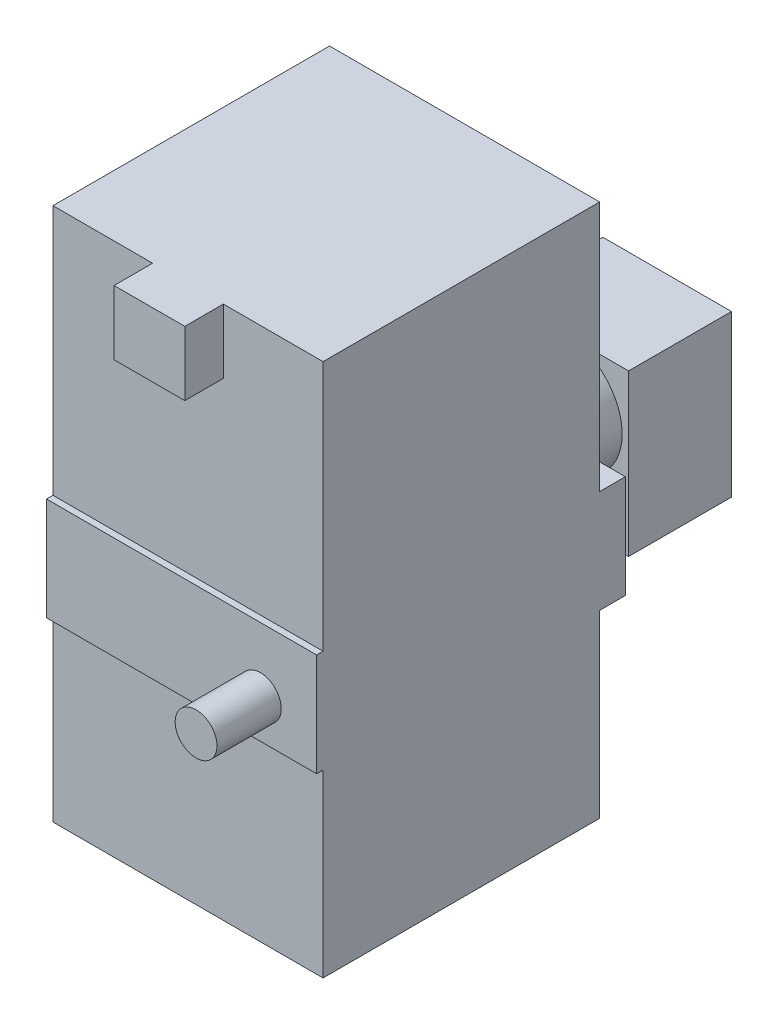
ISO-10303-21;
HEADER;
FILE_DESCRIPTION(('STEP AP214'),'2;1');
FILE_NAME('part.step','',(''),(''),'','','');
FILE_SCHEMA(('AUTOMOTIVE_DESIGN { 1 0 10303 214 1 1 1 1 }'));
ENDSEC;
DATA;
#1=APPLICATION_CONTEXT('core data for automotive mechanical design processes');
#2=APPLICATION_PROTOCOL_DEFINITION('international standard','automotive_design',2000,#1);
#3=PRODUCT_CONTEXT('',#1,'mechanical');
#4=PRODUCT('Part','Part','',(#3));
#5=PRODUCT_RELATED_PRODUCT_CATEGORY('part','',(#4));
#6=PRODUCT_DEFINITION_FORMATION('','',#4);
#7=PRODUCT_DEFINITION_CONTEXT('part definition',#1,'design');
#8=PRODUCT_DEFINITION('design','',#6,#7);
#9=PRODUCT_DEFINITION_SHAPE('','',#8);
#10=(LENGTH_UNIT() NAMED_UNIT(*) SI_UNIT(.MILLI.,.METRE.));
#11=(NAMED_UNIT(*) PLANE_ANGLE_UNIT() SI_UNIT($,.RADIAN.));
#12=(NAMED_UNIT(*) SI_UNIT($,.STERADIAN.) SOLID_ANGLE_UNIT());
#13=UNCERTAINTY_MEASURE_WITH_UNIT(LENGTH_MEASURE(1.E-05),#10,'distance_accuracy_value','');
#14=(GEOMETRIC_REPRESENTATION_CONTEXT(3) GLOBAL_UNCERTAINTY_ASSIGNED_CONTEXT((#13)) GLOBAL_UNIT_ASSIGNED_CONTEXT((#10,
#11,#12)) REPRESENTATION_CONTEXT('',''));
#15=CARTESIAN_POINT('',(0.,0.,0.));
#16=DIRECTION('',(0.,0.,1.));
#17=DIRECTION('',(1.,0.,0.));
#18=AXIS2_PLACEMENT_3D('',#15,#16,#17);
#19=CARTESIAN_POINT('',(0.,0.,-58.));
#20=DIRECTION('',(0.,0.,-1.));
#21=DIRECTION('',(-1.,0.,0.));
#22=AXIS2_PLACEMENT_3D('',#19,#20,#21);
#23=PLANE('',#22);
#24=DIRECTION('',(0.,-1.,0.));
#25=VECTOR('',#24,1.);
#26=CARTESIAN_POINT('',(26.,0.499999999999997,-58.));
#27=LINE('',#26,#25);
#28=CARTESIAN_POINT('',(26.,0.499999999999997,-58.));
#29=VERTEX_POINT('',#28);
#30=CARTESIAN_POINT('',(26.,-24.5,-58.));
#31=VERTEX_POINT('',#30);
#32=EDGE_CURVE('E189',#29,#31,#27,.T.);
#33=ORIENTED_EDGE('',*,*,#32,.T.);
#34=DIRECTION('',(-1.,0.,0.));
#35=VECTOR('',#34,1.);
#36=CARTESIAN_POINT('',(26.,-24.5,-58.));
#37=LINE('',#36,#35);
#38=CARTESIAN_POINT('',(5.99999999999999,-24.5,-58.));
#39=VERTEX_POINT('',#38);
#40=EDGE_CURVE('E178',#31,#39,#37,.T.);
#41=ORIENTED_EDGE('',*,*,#40,.T.);
#42=DIRECTION('',(0.,1.,0.));
#43=VECTOR('',#42,1.);
#44=CARTESIAN_POINT('',(6.,0.499999999999999,-58.));
#45=LINE('',#44,#43);
#46=CARTESIAN_POINT('',(6.,0.499999999999999,-58.));
#47=VERTEX_POINT('',#46);
#48=EDGE_CURVE('E188',#39,#47,#45,.T.);
#49=ORIENTED_EDGE('',*,*,#48,.T.);
#50=DIRECTION('',(1.,0.,0.));
#51=VECTOR('',#50,1.);
#52=CARTESIAN_POINT('',(26.,0.499999999999997,-58.));
#53=LINE('',#52,#51);
#54=EDGE_CURVE('E194',#47,#29,#53,.T.);
#55=ORIENTED_EDGE('',*,*,#54,.T.);
#56=EDGE_LOOP('',(#33,#41,#49,#55));
#57=FACE_BOUND('',#56,.T.);
#58=CARTESIAN_POINT('',(16.,-8.5,-58.));
#59=DIRECTION('',(0.,0.,-1.));
#60=DIRECTION('',(-1.,0.,0.));
#61=AXIS2_PLACEMENT_3D('',#58,#59,#60);
#62=CIRCLE('',#61,3.5);
#63=CARTESIAN_POINT('',(12.5,-8.5,-58.));
#64=VERTEX_POINT('',#63);
#65=EDGE_CURVE('E533',#64,#64,#62,.T.);
#66=ORIENTED_EDGE('',*,*,#65,.F.);
#67=EDGE_LOOP('',(#66));
#68=FACE_BOUND('',#67,.T.);
#69=ADVANCED_FACE('F32',(#57,#68),#23,.T.);
#70=CARTESIAN_POINT('',(42.,-13.5,-25.5));
#71=DIRECTION('',(0.,0.,1.));
#72=DIRECTION('',(1.,0.,0.));
#73=AXIS2_PLACEMENT_3D('',#70,#71,#72);
#74=PLANE('',#73);
#75=CARTESIAN_POINT('',(16.,-8.5,-25.5));
#76=DIRECTION('',(0.,0.,-1.));
#77=DIRECTION('',(-1.,0.,0.));
#78=AXIS2_PLACEMENT_3D('',#75,#76,#77);
#79=CIRCLE('',#78,9.);
#80=CARTESIAN_POINT('',(8.51668522645212,-13.5,-25.5));
#81=VERTEX_POINT('',#80);
#82=CARTESIAN_POINT('',(23.4833147735479,-13.5,-25.5));
#83=VERTEX_POINT('',#82);
#84=EDGE_CURVE('E40',#81,#83,#79,.T.);
#85=ORIENTED_EDGE('',*,*,#84,.F.);
#86=DIRECTION('',(-1.,0.,0.));
#87=VECTOR('',#86,1.);
#88=CARTESIAN_POINT('',(42.,-13.5,-25.5));
#89=LINE('',#88,#87);
#90=CARTESIAN_POINT('',(0.,-13.5,-25.5));
#91=VERTEX_POINT('',#90);
#92=EDGE_CURVE('E308',#81,#91,#89,.T.);
#93=ORIENTED_EDGE('',*,*,#92,.T.);
#94=DIRECTION('',(0.,1.,0.));
#95=VECTOR('',#94,1.);
#96=CARTESIAN_POINT('',(0.,-13.5,-25.5));
#97=LINE('',#96,#95);
#98=CARTESIAN_POINT('',(0.,2.5,-25.5));
#99=VERTEX_POINT('',#98);
#100=EDGE_CURVE('E289',#91,#99,#97,.T.);
#101=ORIENTED_EDGE('',*,*,#100,.T.);
#102=DIRECTION('',(-1.,0.,0.));
#103=VECTOR('',#102,1.);
#104=CARTESIAN_POINT('',(42.,2.5,-25.5));
#105=LINE('',#104,#103);
#106=CARTESIAN_POINT('',(42.,2.5,-25.5));
#107=VERTEX_POINT('',#106);
#108=EDGE_CURVE('E305',#107,#99,#105,.T.);
#109=ORIENTED_EDGE('',*,*,#108,.F.);
#110=DIRECTION('',(0.,1.,0.));
#111=VECTOR('',#110,1.);
#112=CARTESIAN_POINT('',(42.,-13.5,-25.5));
#113=LINE('',#112,#111);
#114=CARTESIAN_POINT('',(42.,-13.5,-25.5));
#115=VERTEX_POINT('',#114);
#116=EDGE_CURVE('E263',#115,#107,#113,.T.);
#117=ORIENTED_EDGE('',*,*,#116,.F.);
#118=EDGE_CURVE('E309',#115,#83,#89,.T.);
#119=ORIENTED_EDGE('',*,*,#118,.T.);
#120=EDGE_LOOP('',(#85,#93,#101,#109,#117,#119));
#121=FACE_BOUND('',#120,.T.);
#122=ADVANCED_FACE('F345',(#121),#74,.F.);
#123=CARTESIAN_POINT('',(42.,-13.5,22.5));
#124=DIRECTION('',(0.,0.,-1.));
#125=DIRECTION('',(-1.,0.,0.));
#126=AXIS2_PLACEMENT_3D('',#123,#124,#125);
#127=PLANE('',#126);
#128=DIRECTION('',(0.,-1.,0.));
#129=VECTOR('',#128,1.);
#130=CARTESIAN_POINT('',(0.,-13.5,22.5));
#131=LINE('',#130,#129);
#132=CARTESIAN_POINT('',(0.,2.5,22.5));
#133=VERTEX_POINT('',#132);
#134=CARTESIAN_POINT('',(0.,-13.5,22.5));
#135=VERTEX_POINT('',#134);
#136=EDGE_CURVE('E276',#133,#135,#131,.T.);
#137=ORIENTED_EDGE('',*,*,#136,.T.);
#138=DIRECTION('',(-1.,0.,0.));
#139=VECTOR('',#138,1.);
#140=CARTESIAN_POINT('',(42.,-13.5,22.5));
#141=LINE('',#140,#139);
#142=CARTESIAN_POINT('',(42.,-13.5,22.5));
#143=VERTEX_POINT('',#142);
#144=EDGE_CURVE('E324',#143,#135,#141,.T.);
#145=ORIENTED_EDGE('',*,*,#144,.F.);
#146=DIRECTION('',(0.,-1.,0.));
#147=VECTOR('',#146,1.);
#148=CARTESIAN_POINT('',(42.,-13.5,22.5));
#149=LINE('',#148,#147);
#150=CARTESIAN_POINT('',(42.,2.5,22.5));
#151=VERTEX_POINT('',#150);
#152=EDGE_CURVE('E251',#151,#143,#149,.T.);
#153=ORIENTED_EDGE('',*,*,#152,.F.);
#154=DIRECTION('',(-1.,0.,0.));
#155=VECTOR('',#154,1.);
#156=CARTESIAN_POINT('',(42.,2.5,22.5));
#157=LINE('',#156,#155);
#158=EDGE_CURVE('E327',#151,#133,#157,.T.);
#159=ORIENTED_EDGE('',*,*,#158,.T.);
#160=EDGE_LOOP('',(#137,#145,#153,#159));
#161=FACE_BOUND('',#160,.T.);
#162=CARTESIAN_POINT('',(33.25,-7.5,22.5));
#163=DIRECTION('',(0.,0.,-1.));
#164=DIRECTION('',(-1.,0.,0.));
#165=AXIS2_PLACEMENT_3D('',#162,#163,#164);
#166=CIRCLE('',#165,3.25);
#167=CARTESIAN_POINT('',(30.,-7.5,22.5));
#168=VERTEX_POINT('',#167);
#169=EDGE_CURVE('E332',#168,#168,#166,.F.);
#170=ORIENTED_EDGE('',*,*,#169,.F.);
#171=EDGE_LOOP('',(#170));
#172=FACE_BOUND('',#171,.T.);
#173=ADVANCED_FACE('F393',(#161,#172),#127,.F.);
#174=CARTESIAN_POINT('',(42.,2.5,21.5));
#175=DIRECTION('',(0.,0.,-1.));
#176=DIRECTION('',(-1.,0.,0.));
#177=AXIS2_PLACEMENT_3D('',#174,#175,#176);
#178=PLANE('',#177);
#179=DIRECTION('',(0.,-1.,0.));
#180=VECTOR('',#179,1.);
#181=CARTESIAN_POINT('',(15.5,41.5,21.5));
#182=LINE('',#181,#180);
#183=CARTESIAN_POINT('',(15.5,41.5,21.5));
#184=VERTEX_POINT('',#183);
#185=CARTESIAN_POINT('',(15.5,31.5,21.5));
#186=VERTEX_POINT('',#185);
#187=EDGE_CURVE('E217',#184,#186,#182,.T.);
#188=ORIENTED_EDGE('',*,*,#187,.F.);
#189=DIRECTION('',(-1.,0.,0.));
#190=VECTOR('',#189,1.);
#191=CARTESIAN_POINT('',(42.,41.5,21.5));
#192=LINE('',#191,#190);
#193=CARTESIAN_POINT('',(0.,41.5,21.5));
#194=VERTEX_POINT('',#193);
#195=EDGE_CURVE('E271',#184,#194,#192,.T.);
#196=ORIENTED_EDGE('',*,*,#195,.T.);
#197=DIRECTION('',(0.,-1.,0.));
#198=VECTOR('',#197,1.);
#199=CARTESIAN_POINT('',(0.,2.5,21.5));
#200=LINE('',#199,#198);
#201=CARTESIAN_POINT('',(0.,2.5,21.5));
#202=VERTEX_POINT('',#201);
#203=EDGE_CURVE('E244',#194,#202,#200,.T.);
#204=ORIENTED_EDGE('',*,*,#203,.T.);
#205=DIRECTION('',(-1.,0.,0.));
#206=VECTOR('',#205,1.);
#207=CARTESIAN_POINT('',(42.,2.5,21.5));
#208=LINE('',#207,#206);
#209=CARTESIAN_POINT('',(42.,2.5,21.5));
#210=VERTEX_POINT('',#209);
#211=EDGE_CURVE('E330',#210,#202,#208,.T.);
#212=ORIENTED_EDGE('',*,*,#211,.F.);
#213=DIRECTION('',(0.,-1.,0.));
#214=VECTOR('',#213,1.);
#215=CARTESIAN_POINT('',(42.,2.5,21.5));
#216=LINE('',#215,#214);
#217=CARTESIAN_POINT('',(42.,41.5,21.5));
#218=VERTEX_POINT('',#217);
#219=EDGE_CURVE('E245',#218,#210,#216,.T.);
#220=ORIENTED_EDGE('',*,*,#219,.F.);
#221=CARTESIAN_POINT('',(26.5,41.5,21.5));
#222=VERTEX_POINT('',#221);
#223=EDGE_CURVE('E297',#218,#222,#192,.T.);
#224=ORIENTED_EDGE('',*,*,#223,.T.);
#225=DIRECTION('',(0.,1.,0.));
#226=VECTOR('',#225,1.);
#227=CARTESIAN_POINT('',(26.5,41.5,21.5));
#228=LINE('',#227,#226);
#229=CARTESIAN_POINT('',(26.5,31.5,21.5));
#230=VERTEX_POINT('',#229);
#231=EDGE_CURVE('E222',#230,#222,#228,.T.);
#232=ORIENTED_EDGE('',*,*,#231,.F.);
#233=DIRECTION('',(1.,0.,0.));
#234=VECTOR('',#233,1.);
#235=CARTESIAN_POINT('',(15.5,31.5,21.5));
#236=LINE('',#235,#234);
#237=EDGE_CURVE('E54',#186,#230,#236,.T.);
#238=ORIENTED_EDGE('',*,*,#237,.F.);
#239=EDGE_LOOP('',(#188,#196,#204,#212,#220,#224,#232,#238));
#240=FACE_BOUND('',#239,.T.);
#241=ADVANCED_FACE('F401',(#240),#178,.F.);
#242=CARTESIAN_POINT('',(42.,2.5,22.5));
#243=DIRECTION('',(0.,-1.,0.));
#244=DIRECTION('',(0.,0.,-1.));
#245=AXIS2_PLACEMENT_3D('',#242,#243,#244);
#246=PLANE('',#245);
#247=DIRECTION('',(0.,0.,1.));
#248=VECTOR('',#247,1.);
#249=CARTESIAN_POINT('',(0.,2.5,22.5));
#250=LINE('',#249,#248);
#251=EDGE_CURVE('E274',#202,#133,#250,.T.);
#252=ORIENTED_EDGE('',*,*,#251,.T.);
#253=ORIENTED_EDGE('',*,*,#158,.F.);
#254=DIRECTION('',(0.,0.,1.));
#255=VECTOR('',#254,1.);
#256=CARTESIAN_POINT('',(42.,2.5,22.5));
#257=LINE('',#256,#255);
#258=EDGE_CURVE('E248',#210,#151,#257,.T.);
#259=ORIENTED_EDGE('',*,*,#258,.F.);
#260=ORIENTED_EDGE('',*,*,#211,.T.);
#261=EDGE_LOOP('',(#252,#253,#259,#260));
#262=FACE_BOUND('',#261,.T.);
#263=ADVANCED_FACE('F398',(#262),#246,.F.);
#264=CARTESIAN_POINT('',(42.,-13.5,22.5));
#265=DIRECTION('',(0.,1.,0.));
#266=DIRECTION('',(0.,0.,1.));
#267=AXIS2_PLACEMENT_3D('',#264,#265,#266);
#268=PLANE('',#267);
#269=DIRECTION('',(0.,0.,-1.));
#270=VECTOR('',#269,1.);
#271=CARTESIAN_POINT('',(0.,-13.5,22.5));
#272=LINE('',#271,#270);
#273=CARTESIAN_POINT('',(0.,-13.5,21.5));
#274=VERTEX_POINT('',#273);
#275=EDGE_CURVE('E278',#135,#274,#272,.T.);
#276=ORIENTED_EDGE('',*,*,#275,.T.);
#277=DIRECTION('',(-1.,0.,0.));
#278=VECTOR('',#277,1.);
#279=CARTESIAN_POINT('',(42.,-13.5,21.5));
#280=LINE('',#279,#278);
#281=CARTESIAN_POINT('',(42.,-13.5,21.5));
#282=VERTEX_POINT('',#281);
#283=EDGE_CURVE('E321',#282,#274,#280,.T.);
#284=ORIENTED_EDGE('',*,*,#283,.F.);
#285=DIRECTION('',(0.,0.,-1.));
#286=VECTOR('',#285,1.);
#287=CARTESIAN_POINT('',(42.,-13.5,22.5));
#288=LINE('',#287,#286);
#289=EDGE_CURVE('E253',#143,#282,#288,.T.);
#290=ORIENTED_EDGE('',*,*,#289,.F.);
#291=ORIENTED_EDGE('',*,*,#144,.T.);
#292=EDGE_LOOP('',(#276,#284,#290,#291));
#293=FACE_BOUND('',#292,.T.);
#294=ADVANCED_FACE('F389',(#293),#268,.F.);
#295=CARTESIAN_POINT('',(42.,-41.5,21.5));
#296=DIRECTION('',(0.,0.,-1.));
#297=DIRECTION('',(-1.,0.,0.));
#298=AXIS2_PLACEMENT_3D('',#295,#296,#297);
#299=PLANE('',#298);
#300=DIRECTION('',(0.,-1.,0.));
#301=VECTOR('',#300,1.);
#302=CARTESIAN_POINT('',(0.,-41.5,21.5));
#303=LINE('',#302,#301);
#304=CARTESIAN_POINT('',(0.,-41.5,21.5));
#305=VERTEX_POINT('',#304);
#306=EDGE_CURVE('E280',#274,#305,#303,.T.);
#307=ORIENTED_EDGE('',*,*,#306,.T.);
#308=DIRECTION('',(-1.,0.,0.));
#309=VECTOR('',#308,1.);
#310=CARTESIAN_POINT('',(42.,-41.5,21.5));
#311=LINE('',#310,#309);
#312=CARTESIAN_POINT('',(42.,-41.5,21.5));
#313=VERTEX_POINT('',#312);
#314=EDGE_CURVE('E318',#313,#305,#311,.T.);
#315=ORIENTED_EDGE('',*,*,#314,.F.);
#316=DIRECTION('',(0.,-1.,0.));
#317=VECTOR('',#316,1.);
#318=CARTESIAN_POINT('',(42.,-41.5,21.5));
#319=LINE('',#318,#317);
#320=EDGE_CURVE('E255',#282,#313,#319,.T.);
#321=ORIENTED_EDGE('',*,*,#320,.F.);
#322=ORIENTED_EDGE('',*,*,#283,.T.);
#323=EDGE_LOOP('',(#307,#315,#321,#322));
#324=FACE_BOUND('',#323,.T.);
#325=ADVANCED_FACE('F385',(#324),#299,.F.);
#326=CARTESIAN_POINT('',(42.,-41.5,-21.5));
#327=DIRECTION('',(0.,1.,0.));
#328=DIRECTION('',(0.,0.,1.));
#329=AXIS2_PLACEMENT_3D('',#326,#327,#328);
#330=PLANE('',#329);
#331=DIRECTION('',(0.,0.,-1.));
#332=VECTOR('',#331,1.);
#333=CARTESIAN_POINT('',(0.,-41.5,-21.5));
#334=LINE('',#333,#332);
#335=CARTESIAN_POINT('',(0.,-41.5,-21.5));
#336=VERTEX_POINT('',#335);
#337=EDGE_CURVE('E282',#305,#336,#334,.T.);
#338=ORIENTED_EDGE('',*,*,#337,.T.);
#339=DIRECTION('',(-1.,0.,0.));
#340=VECTOR('',#339,1.);
#341=CARTESIAN_POINT('',(42.,-41.5,-21.5));
#342=LINE('',#341,#340);
#343=CARTESIAN_POINT('',(42.,-41.5,-21.5));
#344=VERTEX_POINT('',#343);
#345=EDGE_CURVE('E315',#344,#336,#342,.T.);
#346=ORIENTED_EDGE('',*,*,#345,.F.);
#347=DIRECTION('',(0.,0.,-1.));
#348=VECTOR('',#347,1.);
#349=CARTESIAN_POINT('',(42.,-41.5,-21.5));
#350=LINE('',#349,#348);
#351=EDGE_CURVE('E257',#313,#344,#350,.T.);
#352=ORIENTED_EDGE('',*,*,#351,.F.);
#353=ORIENTED_EDGE('',*,*,#314,.T.);
#354=EDGE_LOOP('',(#338,#346,#352,#353));
#355=FACE_BOUND('',#354,.T.);
#356=ADVANCED_FACE('F381',(#355),#330,.F.);
#357=CARTESIAN_POINT('',(42.,-41.5,-21.5));
#358=DIRECTION('',(0.,0.,1.));
#359=DIRECTION('',(0.,-1.,0.));
#360=AXIS2_PLACEMENT_3D('',#357,#358,#359);
#361=PLANE('',#360);
#362=DIRECTION('',(0.,1.,0.));
#363=VECTOR('',#362,1.);
#364=CARTESIAN_POINT('',(0.,-41.5,-21.5));
#365=LINE('',#364,#363);
#366=CARTESIAN_POINT('',(0.,-13.5,-21.5));
#367=VERTEX_POINT('',#366);
#368=EDGE_CURVE('E284',#336,#367,#365,.T.);
#369=ORIENTED_EDGE('',*,*,#368,.T.);
#370=DIRECTION('',(-1.,0.,0.));
#371=VECTOR('',#370,1.);
#372=CARTESIAN_POINT('',(42.,-13.5,-21.5));
#373=LINE('',#372,#371);
#374=CARTESIAN_POINT('',(42.,-13.5,-21.5));
#375=VERTEX_POINT('',#374);
#376=EDGE_CURVE('E311',#375,#367,#373,.T.);
#377=ORIENTED_EDGE('',*,*,#376,.F.);
#378=DIRECTION('',(0.,1.,0.));
#379=VECTOR('',#378,1.);
#380=CARTESIAN_POINT('',(42.,-41.5,-21.5));
#381=LINE('',#380,#379);
#382=EDGE_CURVE('E259',#344,#375,#381,.T.);
#383=ORIENTED_EDGE('',*,*,#382,.F.);
#384=ORIENTED_EDGE('',*,*,#345,.T.);
#385=EDGE_LOOP('',(#369,#377,#383,#384));
#386=FACE_BOUND('',#385,.T.);
#387=ADVANCED_FACE('F376',(#386),#361,.F.);
#388=CARTESIAN_POINT('',(42.,-13.5,-21.5));
#389=DIRECTION('',(0.,1.,0.));
#390=DIRECTION('',(0.,0.,1.));
#391=AXIS2_PLACEMENT_3D('',#388,#389,#390);
#392=PLANE('',#391);
#393=DIRECTION('',(0.,0.,-1.));
#394=VECTOR('',#393,1.);
#395=CARTESIAN_POINT('',(0.,-13.5,-21.5));
#396=LINE('',#395,#394);
#397=EDGE_CURVE('E286',#367,#91,#396,.T.);
#398=ORIENTED_EDGE('',*,*,#397,.T.);
#399=ORIENTED_EDGE('',*,*,#92,.F.);
#400=EDGE_CURVE('E312',#83,#81,#89,.T.);
#401=ORIENTED_EDGE('',*,*,#400,.F.);
#402=ORIENTED_EDGE('',*,*,#118,.F.);
#403=DIRECTION('',(0.,0.,-1.));
#404=VECTOR('',#403,1.);
#405=CARTESIAN_POINT('',(42.,-13.5,-21.5));
#406=LINE('',#405,#404);
#407=EDGE_CURVE('E261',#375,#115,#406,.T.);
#408=ORIENTED_EDGE('',*,*,#407,.F.);
#409=ORIENTED_EDGE('',*,*,#376,.T.);
#410=EDGE_LOOP('',(#398,#399,#401,#402,#408,#409));
#411=FACE_BOUND('',#410,.T.);
#412=ADVANCED_FACE('F349',(#411),#392,.F.);
#413=CARTESIAN_POINT('',(42.,2.5,-21.5));
#414=DIRECTION('',(0.,-1.,0.));
#415=DIRECTION('',(0.,0.,-1.));
#416=AXIS2_PLACEMENT_3D('',#413,#414,#415);
#417=PLANE('',#416);
#418=DIRECTION('',(0.,0.,1.));
#419=VECTOR('',#418,1.);
#420=CARTESIAN_POINT('',(0.,2.5,-21.5));
#421=LINE('',#420,#419);
#422=CARTESIAN_POINT('',(0.,2.5,-21.5));
#423=VERTEX_POINT('',#422);
#424=EDGE_CURVE('E291',#99,#423,#421,.T.);
#425=ORIENTED_EDGE('',*,*,#424,.T.);
#426=DIRECTION('',(-1.,0.,0.));
#427=VECTOR('',#426,1.);
#428=CARTESIAN_POINT('',(42.,2.5,-21.5));
#429=LINE('',#428,#427);
#430=CARTESIAN_POINT('',(42.,2.5,-21.5));
#431=VERTEX_POINT('',#430);
#432=EDGE_CURVE('E302',#431,#423,#429,.T.);
#433=ORIENTED_EDGE('',*,*,#432,.F.);
#434=DIRECTION('',(0.,0.,1.));
#435=VECTOR('',#434,1.);
#436=CARTESIAN_POINT('',(42.,2.5,-21.5));
#437=LINE('',#436,#435);
#438=EDGE_CURVE('E265',#107,#431,#437,.T.);
#439=ORIENTED_EDGE('',*,*,#438,.F.);
#440=ORIENTED_EDGE('',*,*,#108,.T.);
#441=EDGE_LOOP('',(#425,#433,#439,#440));
#442=FACE_BOUND('',#441,.T.);
#443=ADVANCED_FACE('F361',(#442),#417,.F.);
#444=CARTESIAN_POINT('',(42.,2.5,-21.5));
#445=DIRECTION('',(0.,0.,1.));
#446=DIRECTION('',(0.,-1.,0.));
#447=AXIS2_PLACEMENT_3D('',#444,#445,#446);
#448=PLANE('',#447);
#449=DIRECTION('',(0.,1.,0.));
#450=VECTOR('',#449,1.);
#451=CARTESIAN_POINT('',(0.,2.5,-21.5));
#452=LINE('',#451,#450);
#453=CARTESIAN_POINT('',(0.,41.5,-21.5));
#454=VERTEX_POINT('',#453);
#455=EDGE_CURVE('E293',#423,#454,#452,.T.);
#456=ORIENTED_EDGE('',*,*,#455,.T.);
#457=DIRECTION('',(-1.,0.,0.));
#458=VECTOR('',#457,1.);
#459=CARTESIAN_POINT('',(42.,41.5,-21.5));
#460=LINE('',#459,#458);
#461=CARTESIAN_POINT('',(42.,41.5,-21.5));
#462=VERTEX_POINT('',#461);
#463=EDGE_CURVE('E299',#462,#454,#460,.T.);
#464=ORIENTED_EDGE('',*,*,#463,.F.);
#465=DIRECTION('',(0.,1.,0.));
#466=VECTOR('',#465,1.);
#467=CARTESIAN_POINT('',(42.,2.5,-21.5));
#468=LINE('',#467,#466);
#469=EDGE_CURVE('E267',#431,#462,#468,.T.);
#470=ORIENTED_EDGE('',*,*,#469,.F.);
#471=ORIENTED_EDGE('',*,*,#432,.T.);
#472=EDGE_LOOP('',(#456,#464,#470,#471));
#473=FACE_BOUND('',#472,.T.);
#474=ADVANCED_FACE('F365',(#473),#448,.F.);
#475=CARTESIAN_POINT('',(42.,41.5,-21.5));
#476=DIRECTION('',(0.,-1.,0.));
#477=DIRECTION('',(0.,0.,-1.));
#478=AXIS2_PLACEMENT_3D('',#475,#476,#477);
#479=PLANE('',#478);
#480=DIRECTION('',(0.,0.,1.));
#481=VECTOR('',#480,1.);
#482=CARTESIAN_POINT('',(0.,41.5,-21.5));
#483=LINE('',#482,#481);
#484=EDGE_CURVE('E249',#454,#194,#483,.T.);
#485=ORIENTED_EDGE('',*,*,#484,.T.);
#486=ORIENTED_EDGE('',*,*,#195,.F.);
#487=DIRECTION('',(0.,0.,-1.));
#488=VECTOR('',#487,1.);
#489=CARTESIAN_POINT('',(15.5,41.5,27.5));
#490=LINE('',#489,#488);
#491=CARTESIAN_POINT('',(15.5,41.5,27.5));
#492=VERTEX_POINT('',#491);
#493=EDGE_CURVE('E228',#492,#184,#490,.T.);
#494=ORIENTED_EDGE('',*,*,#493,.F.);
#495=DIRECTION('',(-1.,0.,0.));
#496=VECTOR('',#495,1.);
#497=CARTESIAN_POINT('',(15.5,41.5,27.5));
#498=LINE('',#497,#496);
#499=CARTESIAN_POINT('',(26.5,41.5,27.5));
#500=VERTEX_POINT('',#499);
#501=EDGE_CURVE('E226',#500,#492,#498,.T.);
#502=ORIENTED_EDGE('',*,*,#501,.F.);
#503=DIRECTION('',(0.,0.,-1.));
#504=VECTOR('',#503,1.);
#505=CARTESIAN_POINT('',(26.5,41.5,27.5));
#506=LINE('',#505,#504);
#507=EDGE_CURVE('E236',#500,#222,#506,.T.);
#508=ORIENTED_EDGE('',*,*,#507,.T.);
#509=ORIENTED_EDGE('',*,*,#223,.F.);
#510=DIRECTION('',(0.,0.,1.));
#511=VECTOR('',#510,1.);
#512=CARTESIAN_POINT('',(42.,41.5,-21.5));
#513=LINE('',#512,#511);
#514=EDGE_CURVE('E269',#462,#218,#513,.T.);
#515=ORIENTED_EDGE('',*,*,#514,.F.);
#516=ORIENTED_EDGE('',*,*,#463,.T.);
#517=EDGE_LOOP('',(#485,#486,#494,#502,#508,#509,#515,#516));
#518=FACE_BOUND('',#517,.T.);
#519=ADVANCED_FACE('F403',(#518),#479,.F.);
#520=CARTESIAN_POINT('',(42.,0.,0.));
#521=DIRECTION('',(1.,0.,0.));
#522=DIRECTION('',(0.,0.,-1.));
#523=AXIS2_PLACEMENT_3D('',#520,#521,#522);
#524=PLANE('',#523);
#525=ORIENTED_EDGE('',*,*,#219,.T.);
#526=ORIENTED_EDGE('',*,*,#258,.T.);
#527=ORIENTED_EDGE('',*,*,#152,.T.);
#528=ORIENTED_EDGE('',*,*,#289,.T.);
#529=ORIENTED_EDGE('',*,*,#320,.T.);
#530=ORIENTED_EDGE('',*,*,#351,.T.);
#531=ORIENTED_EDGE('',*,*,#382,.T.);
#532=ORIENTED_EDGE('',*,*,#407,.T.);
#533=ORIENTED_EDGE('',*,*,#116,.T.);
#534=ORIENTED_EDGE('',*,*,#438,.T.);
#535=ORIENTED_EDGE('',*,*,#469,.T.);
#536=ORIENTED_EDGE('',*,*,#514,.T.);
#537=EDGE_LOOP('',(#525,#526,#527,#528,#529,#530,#531,#532,#533,#534,#535,#536));
#538=FACE_BOUND('',#537,.T.);
#539=ADVANCED_FACE('F369',(#538),#524,.T.);
#540=CARTESIAN_POINT('',(0.,0.,0.));
#541=DIRECTION('',(1.,0.,0.));
#542=DIRECTION('',(0.,0.,-1.));
#543=AXIS2_PLACEMENT_3D('',#540,#541,#542);
#544=PLANE('',#543);
#545=ORIENTED_EDGE('',*,*,#203,.F.);
#546=ORIENTED_EDGE('',*,*,#484,.F.);
#547=ORIENTED_EDGE('',*,*,#455,.F.);
#548=ORIENTED_EDGE('',*,*,#424,.F.);
#549=ORIENTED_EDGE('',*,*,#100,.F.);
#550=ORIENTED_EDGE('',*,*,#397,.F.);
#551=ORIENTED_EDGE('',*,*,#368,.F.);
#552=ORIENTED_EDGE('',*,*,#337,.F.);
#553=ORIENTED_EDGE('',*,*,#306,.F.);
#554=ORIENTED_EDGE('',*,*,#275,.F.);
#555=ORIENTED_EDGE('',*,*,#136,.F.);
#556=ORIENTED_EDGE('',*,*,#251,.F.);
#557=EDGE_LOOP('',(#545,#546,#547,#548,#549,#550,#551,#552,#553,#554,#555,#556));
#558=FACE_BOUND('',#557,.T.);
#559=ADVANCED_FACE('F356',(#558),#544,.F.);
#560=CARTESIAN_POINT('',(15.5,41.5,27.5));
#561=DIRECTION('',(1.,0.,0.));
#562=DIRECTION('',(0.,1.,0.));
#563=AXIS2_PLACEMENT_3D('',#560,#561,#562);
#564=PLANE('',#563);
#565=ORIENTED_EDGE('',*,*,#187,.T.);
#566=DIRECTION('',(0.,0.,-1.));
#567=VECTOR('',#566,1.);
#568=CARTESIAN_POINT('',(15.5,31.5,27.5));
#569=LINE('',#568,#567);
#570=CARTESIAN_POINT('',(15.5,31.5,27.5));
#571=VERTEX_POINT('',#570);
#572=EDGE_CURVE('E242',#571,#186,#569,.T.);
#573=ORIENTED_EDGE('',*,*,#572,.F.);
#574=DIRECTION('',(0.,-1.,0.));
#575=VECTOR('',#574,1.);
#576=CARTESIAN_POINT('',(15.5,41.5,27.5));
#577=LINE('',#576,#575);
#578=EDGE_CURVE('E218',#492,#571,#577,.T.);
#579=ORIENTED_EDGE('',*,*,#578,.F.);
#580=ORIENTED_EDGE('',*,*,#493,.T.);
#581=EDGE_LOOP('',(#565,#573,#579,#580));
#582=FACE_BOUND('',#581,.T.);
#583=ADVANCED_FACE('F416',(#582),#564,.F.);
#584=CARTESIAN_POINT('',(15.5,31.5,27.5));
#585=DIRECTION('',(0.,1.,0.));
#586=DIRECTION('',(0.,0.,1.));
#587=AXIS2_PLACEMENT_3D('',#584,#585,#586);
#588=PLANE('',#587);
#589=ORIENTED_EDGE('',*,*,#237,.T.);
#590=DIRECTION('',(0.,0.,-1.));
#591=VECTOR('',#590,1.);
#592=CARTESIAN_POINT('',(26.5,31.5,27.5));
#593=LINE('',#592,#591);
#594=CARTESIAN_POINT('',(26.5,31.5,27.5));
#595=VERTEX_POINT('',#594);
#596=EDGE_CURVE('E239',#595,#230,#593,.T.);
#597=ORIENTED_EDGE('',*,*,#596,.F.);
#598=DIRECTION('',(1.,0.,0.));
#599=VECTOR('',#598,1.);
#600=CARTESIAN_POINT('',(15.5,31.5,27.5));
#601=LINE('',#600,#599);
#602=EDGE_CURVE('E221',#571,#595,#601,.T.);
#603=ORIENTED_EDGE('',*,*,#602,.F.);
#604=ORIENTED_EDGE('',*,*,#572,.T.);
#605=EDGE_LOOP('',(#589,#597,#603,#604));
#606=FACE_BOUND('',#605,.T.);
#607=ADVANCED_FACE('F412',(#606),#588,.F.);
#608=CARTESIAN_POINT('',(26.5,41.5,27.5));
#609=DIRECTION('',(-1.,0.,0.));
#610=DIRECTION('',(0.,0.,1.));
#611=AXIS2_PLACEMENT_3D('',#608,#609,#610);
#612=PLANE('',#611);
#613=ORIENTED_EDGE('',*,*,#231,.T.);
#614=ORIENTED_EDGE('',*,*,#507,.F.);
#615=DIRECTION('',(0.,1.,0.));
#616=VECTOR('',#615,1.);
#617=CARTESIAN_POINT('',(26.5,41.5,27.5));
#618=LINE('',#617,#616);
#619=EDGE_CURVE('E224',#595,#500,#618,.T.);
#620=ORIENTED_EDGE('',*,*,#619,.F.);
#621=ORIENTED_EDGE('',*,*,#596,.T.);
#622=EDGE_LOOP('',(#613,#614,#620,#621));
#623=FACE_BOUND('',#622,.T.);
#624=ADVANCED_FACE('F408',(#623),#612,.F.);
#625=CARTESIAN_POINT('',(0.,0.,27.5));
#626=DIRECTION('',(0.,0.,1.));
#627=DIRECTION('',(1.,0.,0.));
#628=AXIS2_PLACEMENT_3D('',#625,#626,#627);
#629=PLANE('',#628);
#630=ORIENTED_EDGE('',*,*,#578,.T.);
#631=ORIENTED_EDGE('',*,*,#602,.T.);
#632=ORIENTED_EDGE('',*,*,#619,.T.);
#633=ORIENTED_EDGE('',*,*,#501,.T.);
#634=EDGE_LOOP('',(#630,#631,#632,#633));
#635=FACE_BOUND('',#634,.T.);
#636=ADVANCED_FACE('F418',(#635),#629,.T.);
#637=CARTESIAN_POINT('',(33.25,-7.5,32.5));
#638=DIRECTION('',(0.,0.,-1.));
#639=DIRECTION('',(-1.,0.,0.));
#640=AXIS2_PLACEMENT_3D('',#637,#638,#639);
#641=CYLINDRICAL_SURFACE('',#640,3.25);
#642=CARTESIAN_POINT('',(33.25,-7.5,32.5));
#643=DIRECTION('',(0.,0.,1.));
#644=DIRECTION('',(1.,0.,0.));
#645=AXIS2_PLACEMENT_3D('',#642,#643,#644);
#646=CIRCLE('',#645,3.25);
#647=CARTESIAN_POINT('',(36.5,-7.5,32.5));
#648=VERTEX_POINT('',#647);
#649=EDGE_CURVE('E213',#648,#648,#646,.T.);
#650=ORIENTED_EDGE('',*,*,#649,.F.);
#651=EDGE_LOOP('',(#650));
#652=FACE_BOUND('',#651,.T.);
#653=ORIENTED_EDGE('',*,*,#169,.T.);
#654=EDGE_LOOP('',(#653));
#655=FACE_BOUND('',#654,.T.);
#656=ADVANCED_FACE('F420',(#652,#655),#641,.T.);
#657=CARTESIAN_POINT('',(33.25,-7.5,32.5));
#658=DIRECTION('',(0.,0.,1.));
#659=DIRECTION('',(1.,0.,0.));
#660=AXIS2_PLACEMENT_3D('',#657,#658,#659);
#661=PLANE('',#660);
#662=ORIENTED_EDGE('',*,*,#649,.T.);
#663=EDGE_LOOP('',(#662));
#664=FACE_BOUND('',#663,.T.);
#665=ADVANCED_FACE('F426',(#664),#661,.T.);
#666=CARTESIAN_POINT('',(16.,-8.5,-25.5));
#667=DIRECTION('',(0.,0.,-1.));
#668=DIRECTION('',(-1.,0.,0.));
#669=AXIS2_PLACEMENT_3D('',#666,#667,#668);
#670=PLANE('',#669);
#671=EDGE_CURVE('E203',#83,#81,#79,.T.);
#672=ORIENTED_EDGE('',*,*,#671,.F.);
#673=ORIENTED_EDGE('',*,*,#400,.T.);
#674=EDGE_LOOP('',(#672,#673));
#675=FACE_BOUND('',#674,.T.);
#676=ADVANCED_FACE('F341',(#675),#670,.F.);
#677=CARTESIAN_POINT('',(16.,-8.5,-42.));
#678=DIRECTION('',(0.,0.,1.));
#679=DIRECTION('',(1.,0.,0.));
#680=AXIS2_PLACEMENT_3D('',#677,#678,#679);
#681=CYLINDRICAL_SURFACE('',#680,9.);
#682=CARTESIAN_POINT('',(16.,-8.5,-42.));
#683=DIRECTION('',(0.,0.,-1.));
#684=DIRECTION('',(-1.,0.,0.));
#685=AXIS2_PLACEMENT_3D('',#682,#683,#684);
#686=CIRCLE('',#685,9.);
#687=CARTESIAN_POINT('',(16.,0.499999999999998,-42.));
#688=VERTEX_POINT('',#687);
#689=EDGE_CURVE('E206',#688,#688,#686,.T.);
#690=ORIENTED_EDGE('',*,*,#689,.F.);
#691=EDGE_LOOP('',(#690));
#692=FACE_BOUND('',#691,.T.);
#693=ORIENTED_EDGE('',*,*,#671,.T.);
#694=ORIENTED_EDGE('',*,*,#84,.T.);
#695=EDGE_LOOP('',(#693,#694));
#696=FACE_BOUND('',#695,.T.);
#697=ADVANCED_FACE('F338',(#692,#696),#681,.T.);
#698=CARTESIAN_POINT('',(0.,0.,-42.));
#699=DIRECTION('',(0.,0.,-1.));
#700=DIRECTION('',(-1.,0.,0.));
#701=AXIS2_PLACEMENT_3D('',#698,#699,#700);
#702=PLANE('',#701);
#703=DIRECTION('',(1.,0.,0.));
#704=VECTOR('',#703,1.);
#705=CARTESIAN_POINT('',(26.,0.499999999999997,-42.));
#706=LINE('',#705,#704);
#707=CARTESIAN_POINT('',(26.,0.499999999999997,-42.));
#708=VERTEX_POINT('',#707);
#709=EDGE_CURVE('E545',#688,#708,#706,.T.);
#710=ORIENTED_EDGE('',*,*,#709,.F.);
#711=ORIENTED_EDGE('',*,*,#689,.T.);
#712=CARTESIAN_POINT('',(6.,0.499999999999999,-42.));
#713=VERTEX_POINT('',#712);
#714=EDGE_CURVE('E198',#713,#688,#706,.T.);
#715=ORIENTED_EDGE('',*,*,#714,.F.);
#716=DIRECTION('',(0.,1.,0.));
#717=VECTOR('',#716,1.);
#718=CARTESIAN_POINT('',(6.,0.499999999999999,-42.));
#719=LINE('',#718,#717);
#720=CARTESIAN_POINT('',(5.99999999999999,-24.5,-42.));
#721=VERTEX_POINT('',#720);
#722=EDGE_CURVE('E543',#721,#713,#719,.T.);
#723=ORIENTED_EDGE('',*,*,#722,.F.);
#724=DIRECTION('',(-1.,0.,0.));
#725=VECTOR('',#724,1.);
#726=CARTESIAN_POINT('',(26.,-24.5,-42.));
#727=LINE('',#726,#725);
#728=CARTESIAN_POINT('',(26.,-24.5,-42.));
#729=VERTEX_POINT('',#728);
#730=EDGE_CURVE('E536',#729,#721,#727,.T.);
#731=ORIENTED_EDGE('',*,*,#730,.F.);
#732=DIRECTION('',(0.,-1.,0.));
#733=VECTOR('',#732,1.);
#734=CARTESIAN_POINT('',(26.,0.499999999999997,-42.));
#735=LINE('',#734,#733);
#736=EDGE_CURVE('E202',#708,#729,#735,.T.);
#737=ORIENTED_EDGE('',*,*,#736,.F.);
#738=EDGE_LOOP('',(#710,#711,#715,#723,#731,#737));
#739=FACE_BOUND('',#738,.T.);
#740=ADVANCED_FACE('F441',(#739),#702,.F.);
#741=CARTESIAN_POINT('',(26.,0.499999999999997,-58.));
#742=DIRECTION('',(-1.,0.,0.));
#743=DIRECTION('',(0.,0.,1.));
#744=AXIS2_PLACEMENT_3D('',#741,#742,#743);
#745=PLANE('',#744);
#746=ORIENTED_EDGE('',*,*,#736,.T.);
#747=DIRECTION('',(0.,0.,1.));
#748=VECTOR('',#747,1.);
#749=CARTESIAN_POINT('',(26.,-24.5,-58.));
#750=LINE('',#749,#748);
#751=EDGE_CURVE('E182',#31,#729,#750,.T.);
#752=ORIENTED_EDGE('',*,*,#751,.F.);
#753=ORIENTED_EDGE('',*,*,#32,.F.);
#754=DIRECTION('',(0.,0.,1.));
#755=VECTOR('',#754,1.);
#756=CARTESIAN_POINT('',(26.,0.499999999999997,-58.));
#757=LINE('',#756,#755);
#758=EDGE_CURVE('E540',#29,#708,#757,.T.);
#759=ORIENTED_EDGE('',*,*,#758,.T.);
#760=EDGE_LOOP('',(#746,#752,#753,#759));
#761=FACE_BOUND('',#760,.T.);
#762=ADVANCED_FACE('F200',(#761),#745,.F.);
#763=CARTESIAN_POINT('',(26.,-24.5,-58.));
#764=DIRECTION('',(0.,1.,0.));
#765=DIRECTION('',(-1.,0.,0.));
#766=AXIS2_PLACEMENT_3D('',#763,#764,#765);
#767=PLANE('',#766);
#768=ORIENTED_EDGE('',*,*,#730,.T.);
#769=DIRECTION('',(0.,0.,1.));
#770=VECTOR('',#769,1.);
#771=CARTESIAN_POINT('',(5.99999999999999,-24.5,-58.));
#772=LINE('',#771,#770);
#773=EDGE_CURVE('E185',#39,#721,#772,.T.);
#774=ORIENTED_EDGE('',*,*,#773,.F.);
#775=ORIENTED_EDGE('',*,*,#40,.F.);
#776=ORIENTED_EDGE('',*,*,#751,.T.);
#777=EDGE_LOOP('',(#768,#774,#775,#776));
#778=FACE_BOUND('',#777,.T.);
#779=ADVANCED_FACE('F180',(#778),#767,.F.);
#780=CARTESIAN_POINT('',(6.,0.499999999999999,-58.));
#781=DIRECTION('',(1.,0.,0.));
#782=DIRECTION('',(0.,1.,0.));
#783=AXIS2_PLACEMENT_3D('',#780,#781,#782);
#784=PLANE('',#783);
#785=ORIENTED_EDGE('',*,*,#722,.T.);
#786=DIRECTION('',(0.,0.,1.));
#787=VECTOR('',#786,1.);
#788=CARTESIAN_POINT('',(6.,0.499999999999999,-58.));
#789=LINE('',#788,#787);
#790=EDGE_CURVE('E208',#47,#713,#789,.T.);
#791=ORIENTED_EDGE('',*,*,#790,.F.);
#792=ORIENTED_EDGE('',*,*,#48,.F.);
#793=ORIENTED_EDGE('',*,*,#773,.T.);
#794=EDGE_LOOP('',(#785,#791,#792,#793));
#795=FACE_BOUND('',#794,.T.);
#796=ADVANCED_FACE('F447',(#795),#784,.F.);
#797=CARTESIAN_POINT('',(26.,0.499999999999997,-58.));
#798=DIRECTION('',(0.,-1.,0.));
#799=DIRECTION('',(1.,0.,0.));
#800=AXIS2_PLACEMENT_3D('',#797,#798,#799);
#801=PLANE('',#800);
#802=ORIENTED_EDGE('',*,*,#714,.T.);
#803=ORIENTED_EDGE('',*,*,#709,.T.);
#804=ORIENTED_EDGE('',*,*,#758,.F.);
#805=ORIENTED_EDGE('',*,*,#54,.F.);
#806=ORIENTED_EDGE('',*,*,#790,.T.);
#807=EDGE_LOOP('',(#802,#803,#804,#805,#806));
#808=FACE_BOUND('',#807,.T.);
#809=ADVANCED_FACE('F444',(#808),#801,.F.);
#810=CARTESIAN_POINT('',(16.,-8.5,-59.));
#811=DIRECTION('',(0.,0.,-1.));
#812=DIRECTION('',(-1.,0.,0.));
#813=AXIS2_PLACEMENT_3D('',#810,#811,#812);
#814=PLANE('',#813);
#815=CARTESIAN_POINT('',(16.,-8.5,-59.));
#816=DIRECTION('',(0.,0.,-1.));
#817=DIRECTION('',(-1.,0.,0.));
#818=AXIS2_PLACEMENT_3D('',#815,#816,#817);
#819=CIRCLE('',#818,0.854248688935412);
#820=CARTESIAN_POINT('',(15.1457513110646,-8.5,-59.));
#821=VERTEX_POINT('',#820);
#822=EDGE_CURVE('E11',#821,#821,#819,.T.);
#823=ORIENTED_EDGE('',*,*,#822,.T.);
#824=EDGE_LOOP('',(#823));
#825=FACE_BOUND('',#824,.T.);
#826=ADVANCED_FACE('F440',(#825),#814,.T.);
#827=CARTESIAN_POINT('',(16.,-8.5,-55.));
#828=DIRECTION('',(0.,0.,1.));
#829=DIRECTION('',(1.,0.,0.));
#830=AXIS2_PLACEMENT_3D('',#827,#828,#829);
#831=DEGENERATE_TOROIDAL_SURFACE('',#830,0.854248688935412,4.,.T.);
#832=ORIENTED_EDGE('',*,*,#65,.T.);
#833=EDGE_LOOP('',(#832));
#834=FACE_BOUND('',#833,.T.);
#835=ORIENTED_EDGE('',*,*,#822,.F.);
#836=EDGE_LOOP('',(#835));
#837=FACE_BOUND('',#836,.T.);
#838=ADVANCED_FACE('F34',(#834,#837),#831,.T.);
#839=CLOSED_SHELL('',(#69,#122,#173,#241,#263,#294,#325,#356,#387,#412,#443,#474,#519,#539,#559,
#583,#607,#624,#636,#656,#665,#676,#697,#740,#762,#779,#796,#809,#826,#838));
#840=MANIFOLD_SOLID_BREP('B2',#839);
#841=ADVANCED_BREP_SHAPE_REPRESENTATION('',(#18,#840),#14);
#842=SHAPE_DEFINITION_REPRESENTATION(#9,#841);
ENDSEC;
END-ISO-10303-21;
